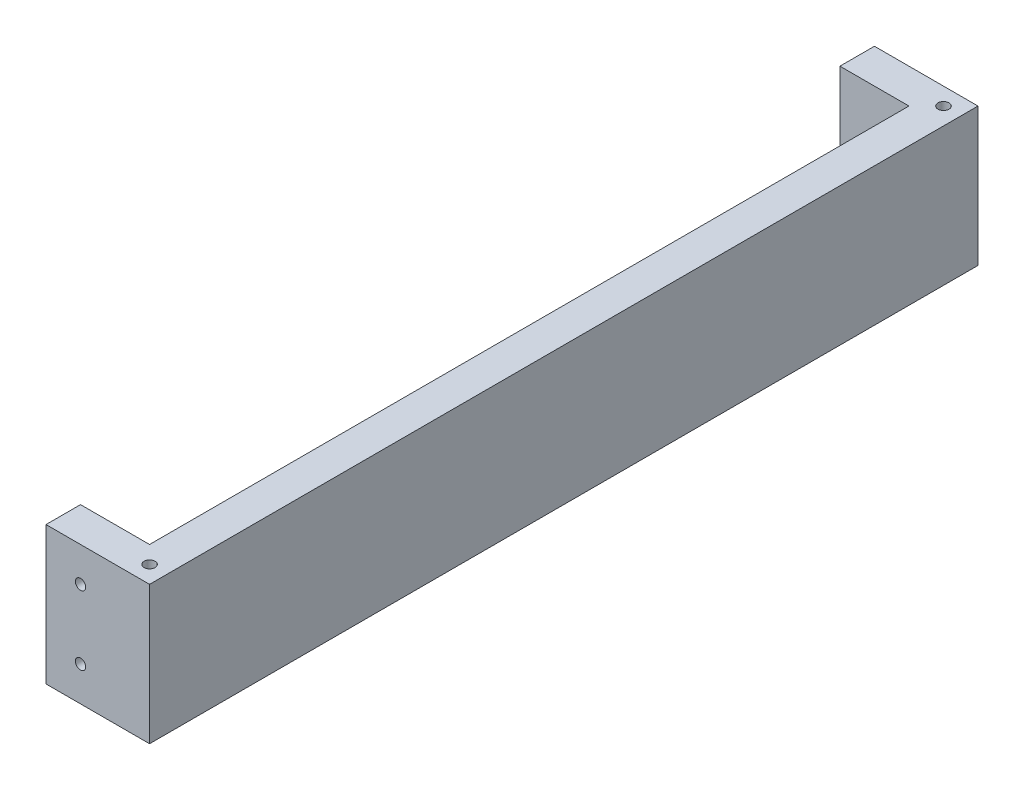
ISO-10303-21;
HEADER;
FILE_DESCRIPTION(('STEP AP214'),'2;1');
FILE_NAME('part.step','',(''),(''),'','','');
FILE_SCHEMA(('AUTOMOTIVE_DESIGN { 1 0 10303 214 1 1 1 1 }'));
ENDSEC;
DATA;
#1=APPLICATION_CONTEXT('core data for automotive mechanical design processes');
#2=APPLICATION_PROTOCOL_DEFINITION('international standard','automotive_design',2000,#1);
#3=PRODUCT_CONTEXT('',#1,'mechanical');
#4=PRODUCT('Part','Part','',(#3));
#5=PRODUCT_RELATED_PRODUCT_CATEGORY('part','',(#4));
#6=PRODUCT_DEFINITION_FORMATION('','',#4);
#7=PRODUCT_DEFINITION_CONTEXT('part definition',#1,'design');
#8=PRODUCT_DEFINITION('design','',#6,#7);
#9=PRODUCT_DEFINITION_SHAPE('','',#8);
#10=(LENGTH_UNIT() NAMED_UNIT(*) SI_UNIT(.MILLI.,.METRE.));
#11=(NAMED_UNIT(*) PLANE_ANGLE_UNIT() SI_UNIT($,.RADIAN.));
#12=(NAMED_UNIT(*) SI_UNIT($,.STERADIAN.) SOLID_ANGLE_UNIT());
#13=UNCERTAINTY_MEASURE_WITH_UNIT(LENGTH_MEASURE(1.E-05),#10,'distance_accuracy_value','');
#14=(GEOMETRIC_REPRESENTATION_CONTEXT(3) GLOBAL_UNCERTAINTY_ASSIGNED_CONTEXT((#13)) GLOBAL_UNIT_ASSIGNED_CONTEXT((#10,
#11,#12)) REPRESENTATION_CONTEXT('',''));
#15=CARTESIAN_POINT('',(0.,0.,0.));
#16=DIRECTION('',(0.,0.,1.));
#17=DIRECTION('',(1.,0.,0.));
#18=AXIS2_PLACEMENT_3D('',#15,#16,#17);
#19=CARTESIAN_POINT('',(11.,20.,-60.));
#20=DIRECTION('',(1.,0.,0.));
#21=DIRECTION('',(0.,1.,0.));
#22=AXIS2_PLACEMENT_3D('',#19,#20,#21);
#23=PLANE('',#22);
#24=DIRECTION('',(0.,1.,0.));
#25=VECTOR('',#24,1.);
#26=CARTESIAN_POINT('',(11.,20.,-55.));
#27=LINE('',#26,#25);
#28=CARTESIAN_POINT('',(11.,9.,-55.));
#29=VERTEX_POINT('',#28);
#30=CARTESIAN_POINT('',(11.,20.,-55.));
#31=VERTEX_POINT('',#30);
#32=EDGE_CURVE('E54',#29,#31,#27,.T.);
#33=ORIENTED_EDGE('',*,*,#32,.F.);
#34=DIRECTION('',(0.,0.,1.));
#35=VECTOR('',#34,1.);
#36=CARTESIAN_POINT('',(11.,9.,-60.));
#37=LINE('',#36,#35);
#38=CARTESIAN_POINT('',(11.,9.,55.));
#39=VERTEX_POINT('',#38);
#40=EDGE_CURVE('E204',#29,#39,#37,.T.);
#41=ORIENTED_EDGE('',*,*,#40,.T.);
#42=DIRECTION('',(0.,-1.,0.));
#43=VECTOR('',#42,1.);
#44=CARTESIAN_POINT('',(11.,20.,55.));
#45=LINE('',#44,#43);
#46=CARTESIAN_POINT('',(11.,20.,55.));
#47=VERTEX_POINT('',#46);
#48=EDGE_CURVE('E168',#47,#39,#45,.T.);
#49=ORIENTED_EDGE('',*,*,#48,.F.);
#50=DIRECTION('',(0.,0.,1.));
#51=VECTOR('',#50,1.);
#52=CARTESIAN_POINT('',(11.,20.,-60.));
#53=LINE('',#52,#51);
#54=EDGE_CURVE('E59',#31,#47,#53,.T.);
#55=ORIENTED_EDGE('',*,*,#54,.F.);
#56=EDGE_LOOP('',(#33,#41,#49,#55));
#57=FACE_BOUND('',#56,.T.);
#58=ADVANCED_FACE('F39',(#57),#23,.F.);
#59=CARTESIAN_POINT('',(1.,9.,-60.));
#60=DIRECTION('',(0.,-1.,0.));
#61=DIRECTION('',(0.,0.,-1.));
#62=AXIS2_PLACEMENT_3D('',#59,#60,#61);
#63=PLANE('',#62);
#64=DIRECTION('',(1.,0.,0.));
#65=VECTOR('',#64,1.);
#66=CARTESIAN_POINT('',(1.,9.,-55.));
#67=LINE('',#66,#65);
#68=CARTESIAN_POINT('',(1.,9.,-55.));
#69=VERTEX_POINT('',#68);
#70=EDGE_CURVE('E160',#69,#29,#67,.T.);
#71=ORIENTED_EDGE('',*,*,#70,.F.);
#72=DIRECTION('',(0.,0.,1.));
#73=VECTOR('',#72,1.);
#74=CARTESIAN_POINT('',(1.,9.,-60.));
#75=LINE('',#74,#73);
#76=CARTESIAN_POINT('',(1.,9.,55.));
#77=VERTEX_POINT('',#76);
#78=EDGE_CURVE('E202',#69,#77,#75,.T.);
#79=ORIENTED_EDGE('',*,*,#78,.T.);
#80=DIRECTION('',(-1.,0.,0.));
#81=VECTOR('',#80,1.);
#82=CARTESIAN_POINT('',(0.999999999999948,9.,55.));
#83=LINE('',#82,#81);
#84=EDGE_CURVE('E11',#39,#77,#83,.T.);
#85=ORIENTED_EDGE('',*,*,#84,.F.);
#86=ORIENTED_EDGE('',*,*,#40,.F.);
#87=EDGE_LOOP('',(#71,#79,#85,#86));
#88=FACE_BOUND('',#87,.T.);
#89=ADVANCED_FACE('F265',(#88),#63,.F.);
#90=CARTESIAN_POINT('',(-1.,2.,-60.));
#91=DIRECTION('',(0.,0.,1.));
#92=DIRECTION('',(1.,0.,0.));
#93=AXIS2_PLACEMENT_3D('',#90,#91,#92);
#94=PLANE('',#93);
#95=CARTESIAN_POINT('',(6.00000000000002,15.,-60.));
#96=DIRECTION('',(0.,0.,-1.));
#97=DIRECTION('',(-1.,0.,0.));
#98=AXIS2_PLACEMENT_3D('',#95,#96,#97);
#99=CIRCLE('',#98,0.75);
#100=CARTESIAN_POINT('',(5.25000000000002,15.,-60.));
#101=VERTEX_POINT('',#100);
#102=EDGE_CURVE('E157',#101,#101,#99,.T.);
#103=ORIENTED_EDGE('',*,*,#102,.F.);
#104=EDGE_LOOP('',(#103));
#105=FACE_BOUND('',#104,.T.);
#106=CARTESIAN_POINT('',(6.00000000000001,5.,-60.));
#107=DIRECTION('',(0.,0.,-1.));
#108=DIRECTION('',(-1.,0.,0.));
#109=AXIS2_PLACEMENT_3D('',#106,#107,#108);
#110=CIRCLE('',#109,0.75);
#111=CARTESIAN_POINT('',(5.25000000000001,5.,-60.));
#112=VERTEX_POINT('',#111);
#113=EDGE_CURVE('E300',#112,#112,#110,.T.);
#114=ORIENTED_EDGE('',*,*,#113,.F.);
#115=EDGE_LOOP('',(#114));
#116=FACE_BOUND('',#115,.T.);
#117=DIRECTION('',(0.,1.,0.));
#118=VECTOR('',#117,1.);
#119=CARTESIAN_POINT('',(1.,0.,-60.));
#120=LINE('',#119,#118);
#121=CARTESIAN_POINT('',(1.00000000000001,0.,-60.));
#122=VERTEX_POINT('',#121);
#123=CARTESIAN_POINT('',(1.,20.,-60.));
#124=VERTEX_POINT('',#123);
#125=EDGE_CURVE('E126',#122,#124,#120,.T.);
#126=ORIENTED_EDGE('',*,*,#125,.T.);
#127=DIRECTION('',(-1.,0.,0.));
#128=VECTOR('',#127,1.);
#129=CARTESIAN_POINT('',(16.,20.,-60.));
#130=LINE('',#129,#128);
#131=CARTESIAN_POINT('',(16.,20.,-60.));
#132=VERTEX_POINT('',#131);
#133=EDGE_CURVE('E129',#132,#124,#130,.T.);
#134=ORIENTED_EDGE('',*,*,#133,.F.);
#135=DIRECTION('',(0.,1.,0.));
#136=VECTOR('',#135,1.);
#137=CARTESIAN_POINT('',(16.,0.,-60.));
#138=LINE('',#137,#136);
#139=CARTESIAN_POINT('',(16.,0.,-60.));
#140=VERTEX_POINT('',#139);
#141=EDGE_CURVE('E211',#140,#132,#138,.T.);
#142=ORIENTED_EDGE('',*,*,#141,.F.);
#143=DIRECTION('',(-1.,0.,0.));
#144=VECTOR('',#143,1.);
#145=CARTESIAN_POINT('',(-1.,0.,-60.));
#146=LINE('',#145,#144);
#147=EDGE_CURVE('E131',#140,#122,#146,.T.);
#148=ORIENTED_EDGE('',*,*,#147,.T.);
#149=EDGE_LOOP('',(#126,#134,#142,#148));
#150=FACE_BOUND('',#149,.T.);
#151=ADVANCED_FACE('F41',(#105,#116,#150),#94,.F.);
#152=CARTESIAN_POINT('',(-1.,2.,60.));
#153=DIRECTION('',(1.,0.,0.));
#154=DIRECTION('',(0.,0.,-1.));
#155=AXIS2_PLACEMENT_3D('',#152,#153,#154);
#156=PLANE('',#155);
#157=DIRECTION('',(0.,0.,1.));
#158=VECTOR('',#157,1.);
#159=CARTESIAN_POINT('',(-1.,0.,60.));
#160=LINE('',#159,#158);
#161=CARTESIAN_POINT('',(-1.,0.,-43.));
#162=VERTEX_POINT('',#161);
#163=CARTESIAN_POINT('',(-1.,0.,43.));
#164=VERTEX_POINT('',#163);
#165=EDGE_CURVE('E223',#162,#164,#160,.T.);
#166=ORIENTED_EDGE('',*,*,#165,.T.);
#167=DIRECTION('',(0.,-1.,0.));
#168=VECTOR('',#167,1.);
#169=CARTESIAN_POINT('',(-1.,20.,43.));
#170=LINE('',#169,#168);
#171=CARTESIAN_POINT('',(-1.,2.,43.));
#172=VERTEX_POINT('',#171);
#173=EDGE_CURVE('E184',#172,#164,#170,.T.);
#174=ORIENTED_EDGE('',*,*,#173,.F.);
#175=DIRECTION('',(0.,0.,1.));
#176=VECTOR('',#175,1.);
#177=CARTESIAN_POINT('',(-1.,2.,60.));
#178=LINE('',#177,#176);
#179=CARTESIAN_POINT('',(-1.,2.,-43.));
#180=VERTEX_POINT('',#179);
#181=EDGE_CURVE('E47',#180,#172,#178,.T.);
#182=ORIENTED_EDGE('',*,*,#181,.F.);
#183=DIRECTION('',(0.,-1.,0.));
#184=VECTOR('',#183,1.);
#185=CARTESIAN_POINT('',(-1.,20.,-43.));
#186=LINE('',#185,#184);
#187=EDGE_CURVE('E176',#180,#162,#186,.T.);
#188=ORIENTED_EDGE('',*,*,#187,.T.);
#189=EDGE_LOOP('',(#166,#174,#182,#188));
#190=FACE_BOUND('',#189,.T.);
#191=ADVANCED_FACE('F245',(#190),#156,.F.);
#192=CARTESIAN_POINT('',(-1.,2.,60.));
#193=DIRECTION('',(0.,0.,-1.));
#194=DIRECTION('',(-1.,0.,0.));
#195=AXIS2_PLACEMENT_3D('',#192,#193,#194);
#196=PLANE('',#195);
#197=CARTESIAN_POINT('',(6.00000000000002,15.,60.));
#198=DIRECTION('',(0.,0.,-1.));
#199=DIRECTION('',(-1.,0.,0.));
#200=AXIS2_PLACEMENT_3D('',#197,#198,#199);
#201=CIRCLE('',#200,0.75);
#202=CARTESIAN_POINT('',(5.25000000000002,15.,60.));
#203=VERTEX_POINT('',#202);
#204=EDGE_CURVE('E385',#203,#203,#201,.T.);
#205=ORIENTED_EDGE('',*,*,#204,.T.);
#206=EDGE_LOOP('',(#205));
#207=FACE_BOUND('',#206,.T.);
#208=CARTESIAN_POINT('',(6.00000000000001,5.,60.));
#209=DIRECTION('',(0.,0.,-1.));
#210=DIRECTION('',(-1.,0.,0.));
#211=AXIS2_PLACEMENT_3D('',#208,#209,#210);
#212=CIRCLE('',#211,0.75);
#213=CARTESIAN_POINT('',(5.25000000000001,5.,60.));
#214=VERTEX_POINT('',#213);
#215=EDGE_CURVE('E372',#214,#214,#212,.T.);
#216=ORIENTED_EDGE('',*,*,#215,.T.);
#217=EDGE_LOOP('',(#216));
#218=FACE_BOUND('',#217,.T.);
#219=DIRECTION('',(1.,0.,0.));
#220=VECTOR('',#219,1.);
#221=CARTESIAN_POINT('',(-1.,0.,60.));
#222=LINE('',#221,#220);
#223=CARTESIAN_POINT('',(1.,0.,60.));
#224=VERTEX_POINT('',#223);
#225=CARTESIAN_POINT('',(16.,0.,60.));
#226=VERTEX_POINT('',#225);
#227=EDGE_CURVE('E219',#224,#226,#222,.T.);
#228=ORIENTED_EDGE('',*,*,#227,.T.);
#229=DIRECTION('',(0.,-1.,0.));
#230=VECTOR('',#229,1.);
#231=CARTESIAN_POINT('',(16.,0.,60.));
#232=LINE('',#231,#230);
#233=CARTESIAN_POINT('',(16.,20.,60.));
#234=VERTEX_POINT('',#233);
#235=EDGE_CURVE('E135',#234,#226,#232,.T.);
#236=ORIENTED_EDGE('',*,*,#235,.F.);
#237=DIRECTION('',(-1.,0.,0.));
#238=VECTOR('',#237,1.);
#239=CARTESIAN_POINT('',(16.,20.,60.));
#240=LINE('',#239,#238);
#241=CARTESIAN_POINT('',(1.,20.,60.));
#242=VERTEX_POINT('',#241);
#243=EDGE_CURVE('E146',#234,#242,#240,.T.);
#244=ORIENTED_EDGE('',*,*,#243,.T.);
#245=DIRECTION('',(0.,-1.,0.));
#246=VECTOR('',#245,1.);
#247=CARTESIAN_POINT('',(1.,0.,60.));
#248=LINE('',#247,#246);
#249=EDGE_CURVE('E136',#242,#224,#248,.T.);
#250=ORIENTED_EDGE('',*,*,#249,.T.);
#251=EDGE_LOOP('',(#228,#236,#244,#250));
#252=FACE_BOUND('',#251,.T.);
#253=ADVANCED_FACE('F230',(#207,#218,#252),#196,.F.);
#254=CARTESIAN_POINT('',(0.,2.,0.));
#255=DIRECTION('',(0.,-1.,0.));
#256=DIRECTION('',(0.,0.,-1.));
#257=AXIS2_PLACEMENT_3D('',#254,#255,#256);
#258=PLANE('',#257);
#259=ORIENTED_EDGE('',*,*,#181,.T.);
#260=DIRECTION('',(1.,0.,0.));
#261=VECTOR('',#260,1.);
#262=CARTESIAN_POINT('',(0.,2.,43.));
#263=LINE('',#262,#261);
#264=CARTESIAN_POINT('',(1.,2.,43.));
#265=VERTEX_POINT('',#264);
#266=EDGE_CURVE('E199',#172,#265,#263,.T.);
#267=ORIENTED_EDGE('',*,*,#266,.T.);
#268=DIRECTION('',(0.,0.,-1.));
#269=VECTOR('',#268,1.);
#270=CARTESIAN_POINT('',(1.,2.,60.));
#271=LINE('',#270,#269);
#272=CARTESIAN_POINT('',(1.00000000000001,2.,-43.));
#273=VERTEX_POINT('',#272);
#274=EDGE_CURVE('E216',#265,#273,#271,.T.);
#275=ORIENTED_EDGE('',*,*,#274,.T.);
#276=DIRECTION('',(-1.,0.,0.));
#277=VECTOR('',#276,1.);
#278=CARTESIAN_POINT('',(0.,2.,-43.));
#279=LINE('',#278,#277);
#280=EDGE_CURVE('E187',#273,#180,#279,.T.);
#281=ORIENTED_EDGE('',*,*,#280,.T.);
#282=EDGE_LOOP('',(#259,#267,#275,#281));
#283=FACE_BOUND('',#282,.T.);
#284=ADVANCED_FACE('F251',(#283),#258,.F.);
#285=CARTESIAN_POINT('',(0.,0.,0.));
#286=DIRECTION('',(0.,-1.,0.));
#287=DIRECTION('',(0.,0.,-1.));
#288=AXIS2_PLACEMENT_3D('',#285,#286,#287);
#289=PLANE('',#288);
#290=DIRECTION('',(0.,0.,1.));
#291=VECTOR('',#290,1.);
#292=CARTESIAN_POINT('',(1.,0.,60.));
#293=LINE('',#292,#291);
#294=CARTESIAN_POINT('',(1.,0.,43.));
#295=VERTEX_POINT('',#294);
#296=EDGE_CURVE('E177',#295,#224,#293,.T.);
#297=ORIENTED_EDGE('',*,*,#296,.F.);
#298=DIRECTION('',(1.,0.,0.));
#299=VECTOR('',#298,1.);
#300=CARTESIAN_POINT('',(1.,0.,43.));
#301=LINE('',#300,#299);
#302=EDGE_CURVE('E180',#164,#295,#301,.T.);
#303=ORIENTED_EDGE('',*,*,#302,.F.);
#304=ORIENTED_EDGE('',*,*,#165,.F.);
#305=DIRECTION('',(-1.,0.,0.));
#306=VECTOR('',#305,1.);
#307=CARTESIAN_POINT('',(1.00000000000001,0.,-43.));
#308=LINE('',#307,#306);
#309=CARTESIAN_POINT('',(1.00000000000001,0.,-43.));
#310=VERTEX_POINT('',#309);
#311=EDGE_CURVE('E192',#310,#162,#308,.T.);
#312=ORIENTED_EDGE('',*,*,#311,.F.);
#313=DIRECTION('',(0.,0.,1.));
#314=VECTOR('',#313,1.);
#315=CARTESIAN_POINT('',(1.00000000000001,0.,-60.));
#316=LINE('',#315,#314);
#317=EDGE_CURVE('E181',#122,#310,#316,.T.);
#318=ORIENTED_EDGE('',*,*,#317,.F.);
#319=ORIENTED_EDGE('',*,*,#147,.F.);
#320=DIRECTION('',(0.,0.,-1.));
#321=VECTOR('',#320,1.);
#322=CARTESIAN_POINT('',(16.,0.,60.));
#323=LINE('',#322,#321);
#324=EDGE_CURVE('E208',#226,#140,#323,.T.);
#325=ORIENTED_EDGE('',*,*,#324,.F.);
#326=ORIENTED_EDGE('',*,*,#227,.F.);
#327=EDGE_LOOP('',(#297,#303,#304,#312,#318,#319,#325,#326));
#328=FACE_BOUND('',#327,.T.);
#329=ADVANCED_FACE('F234',(#328),#289,.T.);
#330=CARTESIAN_POINT('',(1.,0.,0.));
#331=DIRECTION('',(-1.,0.,0.));
#332=DIRECTION('',(0.,0.,1.));
#333=AXIS2_PLACEMENT_3D('',#330,#331,#332);
#334=PLANE('',#333);
#335=ORIENTED_EDGE('',*,*,#274,.F.);
#336=DIRECTION('',(0.,-1.,0.));
#337=VECTOR('',#336,1.);
#338=CARTESIAN_POINT('',(1.,20.,43.));
#339=LINE('',#338,#337);
#340=EDGE_CURVE('E185',#265,#295,#339,.T.);
#341=ORIENTED_EDGE('',*,*,#340,.T.);
#342=ORIENTED_EDGE('',*,*,#296,.T.);
#343=ORIENTED_EDGE('',*,*,#249,.F.);
#344=DIRECTION('',(0.,0.,-1.));
#345=VECTOR('',#344,1.);
#346=CARTESIAN_POINT('',(1.,20.,55.));
#347=LINE('',#346,#345);
#348=CARTESIAN_POINT('',(1.,20.,55.));
#349=VERTEX_POINT('',#348);
#350=EDGE_CURVE('E165',#242,#349,#347,.T.);
#351=ORIENTED_EDGE('',*,*,#350,.T.);
#352=DIRECTION('',(0.,-1.,0.));
#353=VECTOR('',#352,1.);
#354=CARTESIAN_POINT('',(1.,35.8113883008419,55.));
#355=LINE('',#354,#353);
#356=EDGE_CURVE('E164',#349,#77,#355,.T.);
#357=ORIENTED_EDGE('',*,*,#356,.T.);
#358=ORIENTED_EDGE('',*,*,#78,.F.);
#359=DIRECTION('',(0.,-1.,0.));
#360=VECTOR('',#359,1.);
#361=CARTESIAN_POINT('',(1.,35.8113883008419,-55.));
#362=LINE('',#361,#360);
#363=CARTESIAN_POINT('',(1.,20.,-55.));
#364=VERTEX_POINT('',#363);
#365=EDGE_CURVE('E151',#364,#69,#362,.T.);
#366=ORIENTED_EDGE('',*,*,#365,.F.);
#367=DIRECTION('',(0.,0.,-1.));
#368=VECTOR('',#367,1.);
#369=CARTESIAN_POINT('',(1.,20.,-60.));
#370=LINE('',#369,#368);
#371=EDGE_CURVE('E142',#364,#124,#370,.T.);
#372=ORIENTED_EDGE('',*,*,#371,.T.);
#373=ORIENTED_EDGE('',*,*,#125,.F.);
#374=ORIENTED_EDGE('',*,*,#317,.T.);
#375=DIRECTION('',(0.,-1.,0.));
#376=VECTOR('',#375,1.);
#377=CARTESIAN_POINT('',(1.00000000000001,20.,-43.));
#378=LINE('',#377,#376);
#379=EDGE_CURVE('E189',#273,#310,#378,.T.);
#380=ORIENTED_EDGE('',*,*,#379,.F.);
#381=EDGE_LOOP('',(#335,#341,#342,#343,#351,#357,#358,#366,#372,#373,#374,#380));
#382=FACE_BOUND('',#381,.T.);
#383=ADVANCED_FACE('F149',(#382),#334,.T.);
#384=CARTESIAN_POINT('',(16.,20.,60.));
#385=DIRECTION('',(0.,-1.,0.));
#386=DIRECTION('',(0.,0.,-1.));
#387=AXIS2_PLACEMENT_3D('',#384,#385,#386);
#388=PLANE('',#387);
#389=CARTESIAN_POINT('',(13.5,20.,57.5));
#390=DIRECTION('',(0.,1.,0.));
#391=DIRECTION('',(0.,0.,1.));
#392=AXIS2_PLACEMENT_3D('',#389,#390,#391);
#393=CIRCLE('',#392,0.800000000000001);
#394=CARTESIAN_POINT('',(13.5,20.,58.3));
#395=VERTEX_POINT('',#394);
#396=EDGE_CURVE('E369',#395,#395,#393,.T.);
#397=ORIENTED_EDGE('',*,*,#396,.F.);
#398=EDGE_LOOP('',(#397));
#399=FACE_BOUND('',#398,.T.);
#400=CARTESIAN_POINT('',(13.5,20.,-57.5));
#401=DIRECTION('',(0.,1.,0.));
#402=DIRECTION('',(0.,0.,1.));
#403=AXIS2_PLACEMENT_3D('',#400,#401,#402);
#404=CIRCLE('',#403,0.800000000000005);
#405=CARTESIAN_POINT('',(13.5,20.,-56.7));
#406=VERTEX_POINT('',#405);
#407=EDGE_CURVE('E375',#406,#406,#404,.T.);
#408=ORIENTED_EDGE('',*,*,#407,.F.);
#409=EDGE_LOOP('',(#408));
#410=FACE_BOUND('',#409,.T.);
#411=ORIENTED_EDGE('',*,*,#133,.T.);
#412=ORIENTED_EDGE('',*,*,#371,.F.);
#413=DIRECTION('',(-1.,0.,0.));
#414=VECTOR('',#413,1.);
#415=CARTESIAN_POINT('',(1.,20.,-55.));
#416=LINE('',#415,#414);
#417=EDGE_CURVE('E152',#31,#364,#416,.T.);
#418=ORIENTED_EDGE('',*,*,#417,.F.);
#419=ORIENTED_EDGE('',*,*,#54,.T.);
#420=DIRECTION('',(1.,0.,0.));
#421=VECTOR('',#420,1.);
#422=CARTESIAN_POINT('',(1.,20.,55.));
#423=LINE('',#422,#421);
#424=EDGE_CURVE('E169',#349,#47,#423,.T.);
#425=ORIENTED_EDGE('',*,*,#424,.F.);
#426=ORIENTED_EDGE('',*,*,#350,.F.);
#427=ORIENTED_EDGE('',*,*,#243,.F.);
#428=DIRECTION('',(0.,0.,1.));
#429=VECTOR('',#428,1.);
#430=CARTESIAN_POINT('',(16.,20.,60.));
#431=LINE('',#430,#429);
#432=EDGE_CURVE('E145',#132,#234,#431,.T.);
#433=ORIENTED_EDGE('',*,*,#432,.F.);
#434=EDGE_LOOP('',(#411,#412,#418,#419,#425,#426,#427,#433));
#435=FACE_BOUND('',#434,.T.);
#436=ADVANCED_FACE('F140',(#399,#410,#435),#388,.F.);
#437=CARTESIAN_POINT('',(16.,0.,0.));
#438=DIRECTION('',(-1.,0.,0.));
#439=DIRECTION('',(0.,0.,1.));
#440=AXIS2_PLACEMENT_3D('',#437,#438,#439);
#441=PLANE('',#440);
#442=ORIENTED_EDGE('',*,*,#141,.T.);
#443=ORIENTED_EDGE('',*,*,#432,.T.);
#444=ORIENTED_EDGE('',*,*,#235,.T.);
#445=ORIENTED_EDGE('',*,*,#324,.T.);
#446=EDGE_LOOP('',(#442,#443,#444,#445));
#447=FACE_BOUND('',#446,.T.);
#448=ADVANCED_FACE('F236',(#447),#441,.F.);
#449=CARTESIAN_POINT('',(1.00000000000001,20.,-43.));
#450=DIRECTION('',(0.,0.,1.));
#451=DIRECTION('',(1.,0.,0.));
#452=AXIS2_PLACEMENT_3D('',#449,#450,#451);
#453=PLANE('',#452);
#454=ORIENTED_EDGE('',*,*,#379,.T.);
#455=ORIENTED_EDGE('',*,*,#311,.T.);
#456=ORIENTED_EDGE('',*,*,#187,.F.);
#457=ORIENTED_EDGE('',*,*,#280,.F.);
#458=EDGE_LOOP('',(#454,#455,#456,#457));
#459=FACE_BOUND('',#458,.T.);
#460=ADVANCED_FACE('F248',(#459),#453,.F.);
#461=CARTESIAN_POINT('',(1.,20.,43.));
#462=DIRECTION('',(0.,0.,-1.));
#463=DIRECTION('',(-1.,0.,0.));
#464=AXIS2_PLACEMENT_3D('',#461,#462,#463);
#465=PLANE('',#464);
#466=ORIENTED_EDGE('',*,*,#173,.T.);
#467=ORIENTED_EDGE('',*,*,#302,.T.);
#468=ORIENTED_EDGE('',*,*,#340,.F.);
#469=ORIENTED_EDGE('',*,*,#266,.F.);
#470=EDGE_LOOP('',(#466,#467,#468,#469));
#471=FACE_BOUND('',#470,.T.);
#472=ADVANCED_FACE('F252',(#471),#465,.F.);
#473=CARTESIAN_POINT('',(1.,35.8113883008419,55.));
#474=DIRECTION('',(0.,0.,1.));
#475=DIRECTION('',(1.,0.,0.));
#476=AXIS2_PLACEMENT_3D('',#473,#474,#475);
#477=PLANE('',#476);
#478=ORIENTED_EDGE('',*,*,#424,.T.);
#479=ORIENTED_EDGE('',*,*,#48,.T.);
#480=ORIENTED_EDGE('',*,*,#84,.T.);
#481=ORIENTED_EDGE('',*,*,#356,.F.);
#482=EDGE_LOOP('',(#478,#479,#480,#481));
#483=FACE_BOUND('',#482,.T.);
#484=ADVANCED_FACE('F254',(#483),#477,.F.);
#485=CARTESIAN_POINT('',(1.,35.8113883008419,-55.));
#486=DIRECTION('',(0.,0.,-1.));
#487=DIRECTION('',(-1.,0.,0.));
#488=AXIS2_PLACEMENT_3D('',#485,#486,#487);
#489=PLANE('',#488);
#490=ORIENTED_EDGE('',*,*,#70,.T.);
#491=ORIENTED_EDGE('',*,*,#32,.T.);
#492=ORIENTED_EDGE('',*,*,#417,.T.);
#493=ORIENTED_EDGE('',*,*,#365,.T.);
#494=EDGE_LOOP('',(#490,#491,#492,#493));
#495=FACE_BOUND('',#494,.T.);
#496=ADVANCED_FACE('F260',(#495),#489,.F.);
#497=CARTESIAN_POINT('',(6.00000000000001,5.,-58.));
#498=DIRECTION('',(0.,0.,-1.));
#499=DIRECTION('',(-1.,0.,0.));
#500=AXIS2_PLACEMENT_3D('',#497,#498,#499);
#501=CYLINDRICAL_SURFACE('',#500,0.75);
#502=CARTESIAN_POINT('',(6.00000000000001,5.,-58.));
#503=DIRECTION('',(0.,0.,-1.));
#504=DIRECTION('',(-1.,0.,0.));
#505=AXIS2_PLACEMENT_3D('',#502,#503,#504);
#506=CIRCLE('',#505,0.75);
#507=CARTESIAN_POINT('',(5.25000000000001,5.,-58.));
#508=VERTEX_POINT('',#507);
#509=EDGE_CURVE('E302',#508,#508,#506,.T.);
#510=ORIENTED_EDGE('',*,*,#509,.F.);
#511=EDGE_LOOP('',(#510));
#512=FACE_BOUND('',#511,.T.);
#513=ORIENTED_EDGE('',*,*,#113,.T.);
#514=EDGE_LOOP('',(#513));
#515=FACE_BOUND('',#514,.T.);
#516=ADVANCED_FACE('F313',(#512,#515),#501,.F.);
#517=CARTESIAN_POINT('',(6.00000000000001,5.,-58.));
#518=DIRECTION('',(0.,0.,-1.));
#519=DIRECTION('',(-1.,0.,0.));
#520=AXIS2_PLACEMENT_3D('',#517,#518,#519);
#521=PLANE('',#520);
#522=ORIENTED_EDGE('',*,*,#509,.T.);
#523=EDGE_LOOP('',(#522));
#524=FACE_BOUND('',#523,.T.);
#525=ADVANCED_FACE('F317',(#524),#521,.T.);
#526=CARTESIAN_POINT('',(6.00000000000002,15.,-58.));
#527=DIRECTION('',(0.,0.,-1.));
#528=DIRECTION('',(-1.,0.,0.));
#529=AXIS2_PLACEMENT_3D('',#526,#527,#528);
#530=CYLINDRICAL_SURFACE('',#529,0.75);
#531=CARTESIAN_POINT('',(6.00000000000002,15.,-58.));
#532=DIRECTION('',(0.,0.,-1.));
#533=DIRECTION('',(-1.,0.,0.));
#534=AXIS2_PLACEMENT_3D('',#531,#532,#533);
#535=CIRCLE('',#534,0.75);
#536=CARTESIAN_POINT('',(5.25000000000002,15.,-58.));
#537=VERTEX_POINT('',#536);
#538=EDGE_CURVE('E153',#537,#537,#535,.T.);
#539=ORIENTED_EDGE('',*,*,#538,.F.);
#540=EDGE_LOOP('',(#539));
#541=FACE_BOUND('',#540,.T.);
#542=ORIENTED_EDGE('',*,*,#102,.T.);
#543=EDGE_LOOP('',(#542));
#544=FACE_BOUND('',#543,.T.);
#545=ADVANCED_FACE('F322',(#541,#544),#530,.F.);
#546=CARTESIAN_POINT('',(6.00000000000002,15.,-58.));
#547=DIRECTION('',(0.,0.,-1.));
#548=DIRECTION('',(-1.,0.,0.));
#549=AXIS2_PLACEMENT_3D('',#546,#547,#548);
#550=PLANE('',#549);
#551=ORIENTED_EDGE('',*,*,#538,.T.);
#552=EDGE_LOOP('',(#551));
#553=FACE_BOUND('',#552,.T.);
#554=ADVANCED_FACE('F327',(#553),#550,.T.);
#555=CARTESIAN_POINT('',(6.00000000000001,5.,58.));
#556=DIRECTION('',(0.,0.,1.));
#557=DIRECTION('',(1.,0.,0.));
#558=AXIS2_PLACEMENT_3D('',#555,#556,#557);
#559=CYLINDRICAL_SURFACE('',#558,0.75);
#560=CARTESIAN_POINT('',(6.00000000000001,5.,58.));
#561=DIRECTION('',(0.,0.,-1.));
#562=DIRECTION('',(-1.,0.,0.));
#563=AXIS2_PLACEMENT_3D('',#560,#561,#562);
#564=CIRCLE('',#563,0.75);
#565=CARTESIAN_POINT('',(5.25000000000001,5.,58.));
#566=VERTEX_POINT('',#565);
#567=EDGE_CURVE('E368',#566,#566,#564,.T.);
#568=ORIENTED_EDGE('',*,*,#567,.T.);
#569=EDGE_LOOP('',(#568));
#570=FACE_BOUND('',#569,.T.);
#571=ORIENTED_EDGE('',*,*,#215,.F.);
#572=EDGE_LOOP('',(#571));
#573=FACE_BOUND('',#572,.T.);
#574=ADVANCED_FACE('F331',(#570,#573),#559,.F.);
#575=CARTESIAN_POINT('',(6.00000000000001,5.,58.));
#576=DIRECTION('',(0.,0.,-1.));
#577=DIRECTION('',(-1.,0.,0.));
#578=AXIS2_PLACEMENT_3D('',#575,#576,#577);
#579=PLANE('',#578);
#580=ORIENTED_EDGE('',*,*,#567,.F.);
#581=EDGE_LOOP('',(#580));
#582=FACE_BOUND('',#581,.T.);
#583=ADVANCED_FACE('F333',(#582),#579,.F.);
#584=CARTESIAN_POINT('',(6.00000000000002,15.,58.));
#585=DIRECTION('',(0.,0.,1.));
#586=DIRECTION('',(1.,0.,0.));
#587=AXIS2_PLACEMENT_3D('',#584,#585,#586);
#588=CYLINDRICAL_SURFACE('',#587,0.75);
#589=CARTESIAN_POINT('',(6.00000000000002,15.,58.));
#590=DIRECTION('',(0.,0.,-1.));
#591=DIRECTION('',(-1.,0.,0.));
#592=AXIS2_PLACEMENT_3D('',#589,#590,#591);
#593=CIRCLE('',#592,0.75);
#594=CARTESIAN_POINT('',(5.25000000000002,15.,58.));
#595=VERTEX_POINT('',#594);
#596=EDGE_CURVE('E306',#595,#595,#593,.T.);
#597=ORIENTED_EDGE('',*,*,#596,.T.);
#598=EDGE_LOOP('',(#597));
#599=FACE_BOUND('',#598,.T.);
#600=ORIENTED_EDGE('',*,*,#204,.F.);
#601=EDGE_LOOP('',(#600));
#602=FACE_BOUND('',#601,.T.);
#603=ADVANCED_FACE('F336',(#599,#602),#588,.F.);
#604=CARTESIAN_POINT('',(6.00000000000002,15.,58.));
#605=DIRECTION('',(0.,0.,-1.));
#606=DIRECTION('',(-1.,0.,0.));
#607=AXIS2_PLACEMENT_3D('',#604,#605,#606);
#608=PLANE('',#607);
#609=ORIENTED_EDGE('',*,*,#596,.F.);
#610=EDGE_LOOP('',(#609));
#611=FACE_BOUND('',#610,.T.);
#612=ADVANCED_FACE('F343',(#611),#608,.F.);
#613=CARTESIAN_POINT('',(13.5,18.,-57.5));
#614=DIRECTION('',(0.,1.,0.));
#615=DIRECTION('',(0.,0.,1.));
#616=AXIS2_PLACEMENT_3D('',#613,#614,#615);
#617=CYLINDRICAL_SURFACE('',#616,0.800000000000005);
#618=CARTESIAN_POINT('',(13.5,18.,-57.5));
#619=DIRECTION('',(0.,1.,0.));
#620=DIRECTION('',(0.,0.,1.));
#621=AXIS2_PLACEMENT_3D('',#618,#619,#620);
#622=CIRCLE('',#621,0.800000000000005);
#623=CARTESIAN_POINT('',(13.5,18.,-56.7));
#624=VERTEX_POINT('',#623);
#625=EDGE_CURVE('E380',#624,#624,#622,.T.);
#626=ORIENTED_EDGE('',*,*,#625,.F.);
#627=EDGE_LOOP('',(#626));
#628=FACE_BOUND('',#627,.T.);
#629=ORIENTED_EDGE('',*,*,#407,.T.);
#630=EDGE_LOOP('',(#629));
#631=FACE_BOUND('',#630,.T.);
#632=ADVANCED_FACE('F347',(#628,#631),#617,.F.);
#633=CARTESIAN_POINT('',(13.5,18.,-57.5));
#634=DIRECTION('',(0.,1.,0.));
#635=DIRECTION('',(0.,0.,1.));
#636=AXIS2_PLACEMENT_3D('',#633,#634,#635);
#637=PLANE('',#636);
#638=ORIENTED_EDGE('',*,*,#625,.T.);
#639=EDGE_LOOP('',(#638));
#640=FACE_BOUND('',#639,.T.);
#641=ADVANCED_FACE('F349',(#640),#637,.T.);
#642=CARTESIAN_POINT('',(13.5,18.,57.5));
#643=DIRECTION('',(0.,1.,0.));
#644=DIRECTION('',(0.,0.,1.));
#645=AXIS2_PLACEMENT_3D('',#642,#643,#644);
#646=CYLINDRICAL_SURFACE('',#645,0.800000000000001);
#647=CARTESIAN_POINT('',(13.5,18.,57.5));
#648=DIRECTION('',(0.,1.,0.));
#649=DIRECTION('',(0.,0.,1.));
#650=AXIS2_PLACEMENT_3D('',#647,#648,#649);
#651=CIRCLE('',#650,0.800000000000001);
#652=CARTESIAN_POINT('',(13.5,18.,58.3));
#653=VERTEX_POINT('',#652);
#654=EDGE_CURVE('E367',#653,#653,#651,.T.);
#655=ORIENTED_EDGE('',*,*,#654,.F.);
#656=EDGE_LOOP('',(#655));
#657=FACE_BOUND('',#656,.T.);
#658=ORIENTED_EDGE('',*,*,#396,.T.);
#659=EDGE_LOOP('',(#658));
#660=FACE_BOUND('',#659,.T.);
#661=ADVANCED_FACE('F352',(#657,#660),#646,.F.);
#662=CARTESIAN_POINT('',(13.5,18.,57.5));
#663=DIRECTION('',(0.,1.,0.));
#664=DIRECTION('',(0.,0.,1.));
#665=AXIS2_PLACEMENT_3D('',#662,#663,#664);
#666=PLANE('',#665);
#667=ORIENTED_EDGE('',*,*,#654,.T.);
#668=EDGE_LOOP('',(#667));
#669=FACE_BOUND('',#668,.T.);
#670=ADVANCED_FACE('F359',(#669),#666,.T.);
#671=CLOSED_SHELL('',(#58,#89,#151,#191,#253,#284,#329,#383,#436,#448,#460,#472,#484,#496,#516,
#525,#545,#554,#574,#583,#603,#612,#632,#641,#661,#670));
#672=MANIFOLD_SOLID_BREP('B2',#671);
#673=ADVANCED_BREP_SHAPE_REPRESENTATION('',(#18,#672),#14);
#674=SHAPE_DEFINITION_REPRESENTATION(#9,#673);
ENDSEC;
END-ISO-10303-21;
